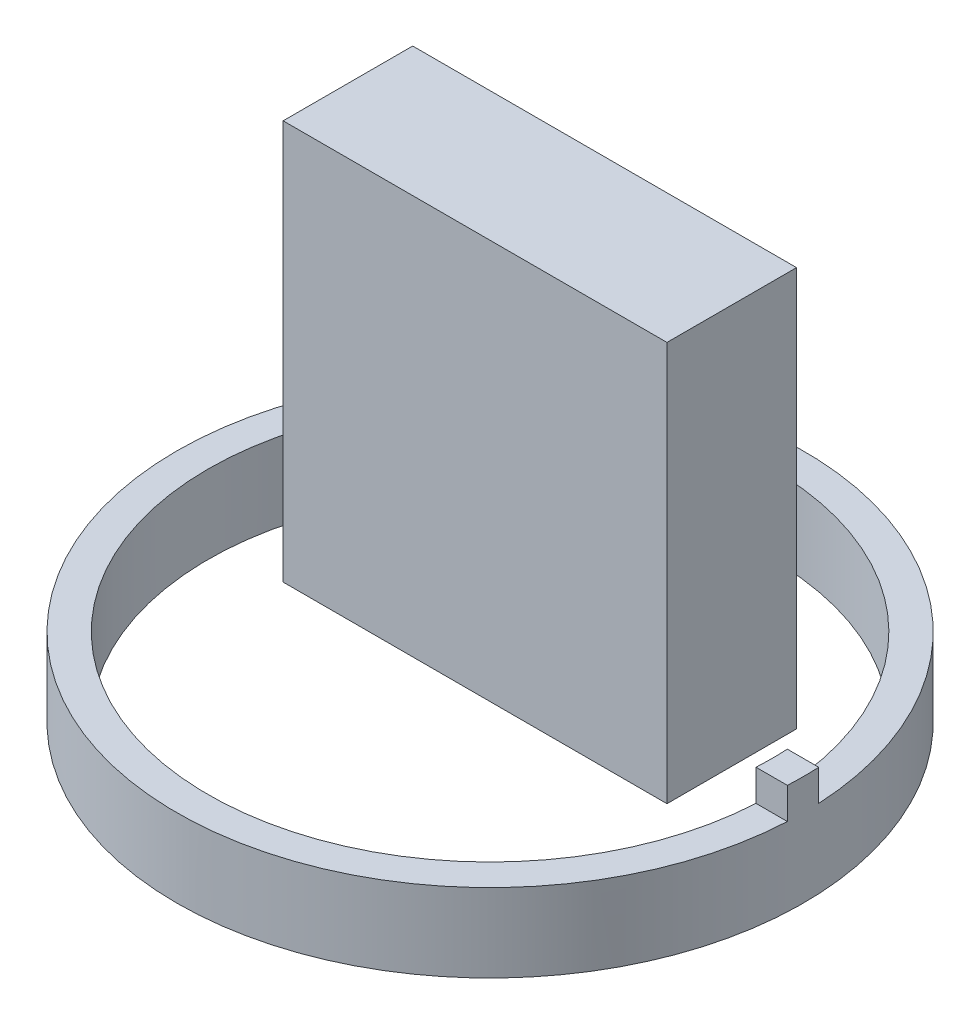
ISO-10303-21;
HEADER;
FILE_DESCRIPTION(('STEP AP214'),'2;1');
FILE_NAME('part.step','',(''),(''),'','','');
FILE_SCHEMA(('AUTOMOTIVE_DESIGN { 1 0 10303 214 1 1 1 1 }'));
ENDSEC;
DATA;
#1=APPLICATION_CONTEXT('core data for automotive mechanical design processes');
#2=APPLICATION_PROTOCOL_DEFINITION('international standard','automotive_design',2000,#1);
#3=PRODUCT_CONTEXT('',#1,'mechanical');
#4=PRODUCT('Part','Part','',(#3));
#5=PRODUCT_RELATED_PRODUCT_CATEGORY('part','',(#4));
#6=PRODUCT_DEFINITION_FORMATION('','',#4);
#7=PRODUCT_DEFINITION_CONTEXT('part definition',#1,'design');
#8=PRODUCT_DEFINITION('design','',#6,#7);
#9=PRODUCT_DEFINITION_SHAPE('','',#8);
#10=(LENGTH_UNIT() NAMED_UNIT(*) SI_UNIT(.MILLI.,.METRE.));
#11=(NAMED_UNIT(*) PLANE_ANGLE_UNIT() SI_UNIT($,.RADIAN.));
#12=(NAMED_UNIT(*) SI_UNIT($,.STERADIAN.) SOLID_ANGLE_UNIT());
#13=UNCERTAINTY_MEASURE_WITH_UNIT(LENGTH_MEASURE(1.E-05),#10,'distance_accuracy_value','');
#14=(GEOMETRIC_REPRESENTATION_CONTEXT(3) GLOBAL_UNCERTAINTY_ASSIGNED_CONTEXT((#13)) GLOBAL_UNIT_ASSIGNED_CONTEXT((#10,
#11,#12)) REPRESENTATION_CONTEXT('',''));
#15=CARTESIAN_POINT('',(0.,0.,0.));
#16=DIRECTION('',(0.,0.,1.));
#17=DIRECTION('',(1.,0.,0.));
#18=AXIS2_PLACEMENT_3D('',#15,#16,#17);
#19=CARTESIAN_POINT('',(0.,6.35,0.));
#20=DIRECTION('',(0.,1.,0.));
#21=DIRECTION('',(0.,0.,1.));
#22=AXIS2_PLACEMENT_3D('',#19,#20,#21);
#23=PLANE('',#22);
#24=CARTESIAN_POINT('',(0.,6.35,0.));
#25=DIRECTION('',(0.,1.,0.));
#26=DIRECTION('',(0.,0.,1.));
#27=AXIS2_PLACEMENT_3D('',#24,#25,#26);
#28=CIRCLE('',#27,25.4);
#29=CARTESIAN_POINT('',(25.3682301314065,6.35,-1.27));
#30=VERTEX_POINT('',#29);
#31=CARTESIAN_POINT('',(25.3682301314065,6.35,1.27));
#32=VERTEX_POINT('',#31);
#33=EDGE_CURVE('E13',#30,#32,#28,.T.);
#34=ORIENTED_EDGE('',*,*,#33,.T.);
#35=DIRECTION('',(-1.,0.,0.));
#36=VECTOR('',#35,1.);
#37=CARTESIAN_POINT('',(0.,6.35,1.27));
#38=LINE('',#37,#36);
#39=CARTESIAN_POINT('',(22.8246949596265,6.35,1.27));
#40=VERTEX_POINT('',#39);
#41=EDGE_CURVE('E75',#32,#40,#38,.T.);
#42=ORIENTED_EDGE('',*,*,#41,.T.);
#43=CARTESIAN_POINT('',(0.,6.35,0.));
#44=DIRECTION('',(0.,1.,0.));
#45=DIRECTION('',(0.,0.,1.));
#46=AXIS2_PLACEMENT_3D('',#43,#44,#45);
#47=CIRCLE('',#46,22.86);
#48=CARTESIAN_POINT('',(22.8246949596265,6.35,-1.27));
#49=VERTEX_POINT('',#48);
#50=EDGE_CURVE('E125',#49,#40,#47,.T.);
#51=ORIENTED_EDGE('',*,*,#50,.F.);
#52=DIRECTION('',(-1.,0.,0.));
#53=VECTOR('',#52,1.);
#54=CARTESIAN_POINT('',(0.,6.35,-1.27));
#55=LINE('',#54,#53);
#56=EDGE_CURVE('E80',#30,#49,#55,.T.);
#57=ORIENTED_EDGE('',*,*,#56,.F.);
#58=EDGE_LOOP('',(#34,#42,#51,#57));
#59=FACE_BOUND('',#58,.T.);
#60=ADVANCED_FACE('F61',(#59),#23,.T.);
#61=CARTESIAN_POINT('',(0.,0.,0.));
#62=DIRECTION('',(0.,1.,0.));
#63=DIRECTION('',(0.,0.,1.));
#64=AXIS2_PLACEMENT_3D('',#61,#62,#63);
#65=PLANE('',#64);
#66=CARTESIAN_POINT('',(0.,0.,0.));
#67=DIRECTION('',(0.,1.,0.));
#68=DIRECTION('',(0.,0.,1.));
#69=AXIS2_PLACEMENT_3D('',#66,#67,#68);
#70=CIRCLE('',#69,25.4);
#71=CARTESIAN_POINT('',(0.,0.,25.4));
#72=VERTEX_POINT('',#71);
#73=EDGE_CURVE('E65',#72,#72,#70,.T.);
#74=ORIENTED_EDGE('',*,*,#73,.F.);
#75=EDGE_LOOP('',(#74));
#76=FACE_BOUND('',#75,.T.);
#77=CARTESIAN_POINT('',(0.,0.,0.));
#78=DIRECTION('',(0.,1.,0.));
#79=DIRECTION('',(0.,0.,1.));
#80=AXIS2_PLACEMENT_3D('',#77,#78,#79);
#81=CIRCLE('',#80,22.86);
#82=CARTESIAN_POINT('',(0.,0.,22.86));
#83=VERTEX_POINT('',#82);
#84=EDGE_CURVE('E122',#83,#83,#81,.T.);
#85=ORIENTED_EDGE('',*,*,#84,.T.);
#86=EDGE_LOOP('',(#85));
#87=FACE_BOUND('',#86,.T.);
#88=ADVANCED_FACE('F136',(#76,#87),#65,.F.);
#89=CARTESIAN_POINT('',(0.,6.35,0.));
#90=DIRECTION('',(0.,-1.,0.));
#91=DIRECTION('',(0.,0.,-1.));
#92=AXIS2_PLACEMENT_3D('',#89,#90,#91);
#93=CYLINDRICAL_SURFACE('',#92,25.4);
#94=ORIENTED_EDGE('',*,*,#33,.F.);
#95=DIRECTION('',(0.,-1.,0.));
#96=VECTOR('',#95,1.);
#97=CARTESIAN_POINT('',(25.3682301314065,8.89,-1.27));
#98=LINE('',#97,#96);
#99=CARTESIAN_POINT('',(25.3682301314065,8.89,-1.27));
#100=VERTEX_POINT('',#99);
#101=EDGE_CURVE('E104',#100,#30,#98,.T.);
#102=ORIENTED_EDGE('',*,*,#101,.F.);
#103=CARTESIAN_POINT('',(0.,8.89,0.));
#104=DIRECTION('',(0.,1.,0.));
#105=DIRECTION('',(0.,0.,1.));
#106=AXIS2_PLACEMENT_3D('',#103,#104,#105);
#107=CIRCLE('',#106,25.4);
#108=CARTESIAN_POINT('',(25.3682301314065,8.89,1.27));
#109=VERTEX_POINT('',#108);
#110=EDGE_CURVE('E111',#109,#100,#107,.T.);
#111=ORIENTED_EDGE('',*,*,#110,.F.);
#112=DIRECTION('',(0.,-1.,0.));
#113=VECTOR('',#112,1.);
#114=CARTESIAN_POINT('',(25.3682301314065,8.89,1.27));
#115=LINE('',#114,#113);
#116=EDGE_CURVE('E154',#109,#32,#115,.T.);
#117=ORIENTED_EDGE('',*,*,#116,.T.);
#118=EDGE_LOOP('',(#94,#102,#111,#117));
#119=FACE_BOUND('',#118,.T.);
#120=ORIENTED_EDGE('',*,*,#73,.T.);
#121=EDGE_LOOP('',(#120));
#122=FACE_BOUND('',#121,.T.);
#123=ADVANCED_FACE('F63',(#119,#122),#93,.T.);
#124=CARTESIAN_POINT('',(0.,6.35,0.));
#125=DIRECTION('',(0.,-1.,0.));
#126=DIRECTION('',(0.,0.,-1.));
#127=AXIS2_PLACEMENT_3D('',#124,#125,#126);
#128=CYLINDRICAL_SURFACE('',#127,22.86);
#129=ORIENTED_EDGE('',*,*,#50,.T.);
#130=DIRECTION('',(0.,-1.,0.));
#131=VECTOR('',#130,1.);
#132=CARTESIAN_POINT('',(22.8246949596265,8.89,1.27));
#133=LINE('',#132,#131);
#134=CARTESIAN_POINT('',(22.8246949596265,8.89,1.27));
#135=VERTEX_POINT('',#134);
#136=EDGE_CURVE('E127',#135,#40,#133,.T.);
#137=ORIENTED_EDGE('',*,*,#136,.F.);
#138=CARTESIAN_POINT('',(0.,8.89,0.));
#139=DIRECTION('',(0.,1.,0.));
#140=DIRECTION('',(0.,0.,1.));
#141=AXIS2_PLACEMENT_3D('',#138,#139,#140);
#142=CIRCLE('',#141,22.86);
#143=CARTESIAN_POINT('',(22.8246949596265,8.89,-1.27));
#144=VERTEX_POINT('',#143);
#145=EDGE_CURVE('E110',#135,#144,#142,.T.);
#146=ORIENTED_EDGE('',*,*,#145,.T.);
#147=DIRECTION('',(0.,-1.,0.));
#148=VECTOR('',#147,1.);
#149=CARTESIAN_POINT('',(22.8246949596265,8.89,-1.27));
#150=LINE('',#149,#148);
#151=EDGE_CURVE('E106',#144,#49,#150,.T.);
#152=ORIENTED_EDGE('',*,*,#151,.T.);
#153=EDGE_LOOP('',(#129,#137,#146,#152));
#154=FACE_BOUND('',#153,.T.);
#155=ORIENTED_EDGE('',*,*,#84,.F.);
#156=EDGE_LOOP('',(#155));
#157=FACE_BOUND('',#156,.T.);
#158=ADVANCED_FACE('F141',(#154,#157),#128,.F.);
#159=CARTESIAN_POINT('',(0.,8.89,-1.27));
#160=DIRECTION('',(0.,0.,1.));
#161=DIRECTION('',(1.,0.,0.));
#162=AXIS2_PLACEMENT_3D('',#159,#160,#161);
#163=PLANE('',#162);
#164=ORIENTED_EDGE('',*,*,#56,.T.);
#165=ORIENTED_EDGE('',*,*,#151,.F.);
#166=DIRECTION('',(-1.,0.,0.));
#167=VECTOR('',#166,1.);
#168=CARTESIAN_POINT('',(0.,8.89,-1.27));
#169=LINE('',#168,#167);
#170=EDGE_CURVE('E100',#100,#144,#169,.T.);
#171=ORIENTED_EDGE('',*,*,#170,.F.);
#172=ORIENTED_EDGE('',*,*,#101,.T.);
#173=EDGE_LOOP('',(#164,#165,#171,#172));
#174=FACE_BOUND('',#173,.T.);
#175=ADVANCED_FACE('F102',(#174),#163,.F.);
#176=CARTESIAN_POINT('',(0.,8.89,1.27));
#177=DIRECTION('',(0.,0.,1.));
#178=DIRECTION('',(1.,0.,0.));
#179=AXIS2_PLACEMENT_3D('',#176,#177,#178);
#180=PLANE('',#179);
#181=ORIENTED_EDGE('',*,*,#41,.F.);
#182=ORIENTED_EDGE('',*,*,#116,.F.);
#183=DIRECTION('',(-1.,0.,0.));
#184=VECTOR('',#183,1.);
#185=CARTESIAN_POINT('',(0.,8.89,1.27));
#186=LINE('',#185,#184);
#187=EDGE_CURVE('E117',#109,#135,#186,.T.);
#188=ORIENTED_EDGE('',*,*,#187,.T.);
#189=ORIENTED_EDGE('',*,*,#136,.T.);
#190=EDGE_LOOP('',(#181,#182,#188,#189));
#191=FACE_BOUND('',#190,.T.);
#192=ADVANCED_FACE('F148',(#191),#180,.T.);
#193=CARTESIAN_POINT('',(0.,8.89,0.));
#194=DIRECTION('',(0.,1.,0.));
#195=DIRECTION('',(0.,0.,1.));
#196=AXIS2_PLACEMENT_3D('',#193,#194,#195);
#197=PLANE('',#196);
#198=ORIENTED_EDGE('',*,*,#110,.T.);
#199=ORIENTED_EDGE('',*,*,#170,.T.);
#200=ORIENTED_EDGE('',*,*,#145,.F.);
#201=ORIENTED_EDGE('',*,*,#187,.F.);
#202=EDGE_LOOP('',(#198,#199,#200,#201));
#203=FACE_BOUND('',#202,.T.);
#204=ADVANCED_FACE('F115',(#203),#197,.T.);
#205=CLOSED_SHELL('',(#60,#88,#123,#158,#175,#192,#204));
#206=MANIFOLD_SOLID_BREP('B2',#205);
#207=CARTESIAN_POINT('',(-18.2254134035002,32.385,-1.44966362960123));
#208=DIRECTION('',(0.,0.,-1.));
#209=DIRECTION('',(-1.,0.,0.));
#210=AXIS2_PLACEMENT_3D('',#207,#208,#209);
#211=PLANE('',#210);
#212=DIRECTION('',(1.,0.,0.));
#213=VECTOR('',#212,1.);
#214=CARTESIAN_POINT('',(-18.2254134035002,0.,-1.44966362960123));
#215=LINE('',#214,#213);
#216=CARTESIAN_POINT('',(-18.2254134035002,0.,-1.44966362960123));
#217=VERTEX_POINT('',#216);
#218=CARTESIAN_POINT('',(12.8895865964998,0.,-1.44966362960123));
#219=VERTEX_POINT('',#218);
#220=EDGE_CURVE('E279',#217,#219,#215,.T.);
#221=ORIENTED_EDGE('',*,*,#220,.T.);
#222=DIRECTION('',(0.,-1.,0.));
#223=VECTOR('',#222,1.);
#224=CARTESIAN_POINT('',(12.8895865964998,32.385,-1.44966362960123));
#225=LINE('',#224,#223);
#226=CARTESIAN_POINT('',(12.8895865964998,32.385,-1.44966362960123));
#227=VERTEX_POINT('',#226);
#228=EDGE_CURVE('E59',#227,#219,#225,.T.);
#229=ORIENTED_EDGE('',*,*,#228,.F.);
#230=DIRECTION('',(1.,0.,0.));
#231=VECTOR('',#230,1.);
#232=CARTESIAN_POINT('',(-18.2254134035002,32.385,-1.44966362960123));
#233=LINE('',#232,#231);
#234=CARTESIAN_POINT('',(-18.2254134035002,32.385,-1.44966362960123));
#235=VERTEX_POINT('',#234);
#236=EDGE_CURVE('E252',#235,#227,#233,.T.);
#237=ORIENTED_EDGE('',*,*,#236,.F.);
#238=DIRECTION('',(0.,-1.,0.));
#239=VECTOR('',#238,1.);
#240=CARTESIAN_POINT('',(-18.2254134035002,32.385,-1.44966362960123));
#241=LINE('',#240,#239);
#242=EDGE_CURVE('E275',#235,#217,#241,.T.);
#243=ORIENTED_EDGE('',*,*,#242,.T.);
#244=EDGE_LOOP('',(#221,#229,#237,#243));
#245=FACE_BOUND('',#244,.T.);
#246=ADVANCED_FACE('F212',(#245),#211,.F.);
#247=CARTESIAN_POINT('',(12.8895865964998,32.385,-11.9525636296012));
#248=DIRECTION('',(1.,0.,0.));
#249=DIRECTION('',(0.,0.,-1.));
#250=AXIS2_PLACEMENT_3D('',#247,#248,#249);
#251=PLANE('',#250);
#252=DIRECTION('',(0.,0.,1.));
#253=VECTOR('',#252,1.);
#254=CARTESIAN_POINT('',(12.8895865964998,0.,-11.9525636296012));
#255=LINE('',#254,#253);
#256=CARTESIAN_POINT('',(12.8895865964998,0.,-11.9525636296012));
#257=VERTEX_POINT('',#256);
#258=EDGE_CURVE('E261',#257,#219,#255,.T.);
#259=ORIENTED_EDGE('',*,*,#258,.F.);
#260=DIRECTION('',(0.,-1.,0.));
#261=VECTOR('',#260,1.);
#262=CARTESIAN_POINT('',(12.8895865964998,32.385,-11.9525636296012));
#263=LINE('',#262,#261);
#264=CARTESIAN_POINT('',(12.8895865964998,32.385,-11.9525636296012));
#265=VERTEX_POINT('',#264);
#266=EDGE_CURVE('E221',#265,#257,#263,.T.);
#267=ORIENTED_EDGE('',*,*,#266,.F.);
#268=DIRECTION('',(0.,0.,1.));
#269=VECTOR('',#268,1.);
#270=CARTESIAN_POINT('',(12.8895865964998,32.385,-11.9525636296012));
#271=LINE('',#270,#269);
#272=EDGE_CURVE('E259',#265,#227,#271,.T.);
#273=ORIENTED_EDGE('',*,*,#272,.T.);
#274=ORIENTED_EDGE('',*,*,#228,.T.);
#275=EDGE_LOOP('',(#259,#267,#273,#274));
#276=FACE_BOUND('',#275,.T.);
#277=ADVANCED_FACE('F258',(#276),#251,.T.);
#278=CARTESIAN_POINT('',(-18.2254134035002,32.385,-11.9525636296012));
#279=DIRECTION('',(0.,0.,-1.));
#280=DIRECTION('',(-1.,0.,0.));
#281=AXIS2_PLACEMENT_3D('',#278,#279,#280);
#282=PLANE('',#281);
#283=DIRECTION('',(1.,0.,0.));
#284=VECTOR('',#283,1.);
#285=CARTESIAN_POINT('',(-18.2254134035002,0.,-11.9525636296012));
#286=LINE('',#285,#284);
#287=CARTESIAN_POINT('',(-18.2254134035002,0.,-11.9525636296012));
#288=VERTEX_POINT('',#287);
#289=EDGE_CURVE('E285',#288,#257,#286,.T.);
#290=ORIENTED_EDGE('',*,*,#289,.F.);
#291=DIRECTION('',(0.,-1.,0.));
#292=VECTOR('',#291,1.);
#293=CARTESIAN_POINT('',(-18.2254134035002,32.385,-11.9525636296012));
#294=LINE('',#293,#292);
#295=CARTESIAN_POINT('',(-18.2254134035002,32.385,-11.9525636296012));
#296=VERTEX_POINT('',#295);
#297=EDGE_CURVE('E244',#296,#288,#294,.T.);
#298=ORIENTED_EDGE('',*,*,#297,.F.);
#299=DIRECTION('',(1.,0.,0.));
#300=VECTOR('',#299,1.);
#301=CARTESIAN_POINT('',(-18.2254134035002,32.385,-11.9525636296012));
#302=LINE('',#301,#300);
#303=EDGE_CURVE('E268',#296,#265,#302,.T.);
#304=ORIENTED_EDGE('',*,*,#303,.T.);
#305=ORIENTED_EDGE('',*,*,#266,.T.);
#306=EDGE_LOOP('',(#290,#298,#304,#305));
#307=FACE_BOUND('',#306,.T.);
#308=ADVANCED_FACE('F271',(#307),#282,.T.);
#309=CARTESIAN_POINT('',(-18.2254134035002,32.385,-11.9525636296012));
#310=DIRECTION('',(1.,0.,0.));
#311=DIRECTION('',(0.,0.,-1.));
#312=AXIS2_PLACEMENT_3D('',#309,#310,#311);
#313=PLANE('',#312);
#314=DIRECTION('',(0.,0.,1.));
#315=VECTOR('',#314,1.);
#316=CARTESIAN_POINT('',(-18.2254134035002,0.,-11.9525636296012));
#317=LINE('',#316,#315);
#318=EDGE_CURVE('E247',#288,#217,#317,.T.);
#319=ORIENTED_EDGE('',*,*,#318,.T.);
#320=ORIENTED_EDGE('',*,*,#242,.F.);
#321=DIRECTION('',(0.,0.,1.));
#322=VECTOR('',#321,1.);
#323=CARTESIAN_POINT('',(-18.2254134035002,32.385,-11.9525636296012));
#324=LINE('',#323,#322);
#325=EDGE_CURVE('E229',#296,#235,#324,.T.);
#326=ORIENTED_EDGE('',*,*,#325,.F.);
#327=ORIENTED_EDGE('',*,*,#297,.T.);
#328=EDGE_LOOP('',(#319,#320,#326,#327));
#329=FACE_BOUND('',#328,.T.);
#330=ADVANCED_FACE('F302',(#329),#313,.F.);
#331=CARTESIAN_POINT('',(0.,32.385,0.));
#332=DIRECTION('',(0.,-1.,0.));
#333=DIRECTION('',(0.,0.,-1.));
#334=AXIS2_PLACEMENT_3D('',#331,#332,#333);
#335=PLANE('',#334);
#336=ORIENTED_EDGE('',*,*,#236,.T.);
#337=ORIENTED_EDGE('',*,*,#272,.F.);
#338=ORIENTED_EDGE('',*,*,#303,.F.);
#339=ORIENTED_EDGE('',*,*,#325,.T.);
#340=EDGE_LOOP('',(#336,#337,#338,#339));
#341=FACE_BOUND('',#340,.T.);
#342=ADVANCED_FACE('F267',(#341),#335,.F.);
#343=CARTESIAN_POINT('',(0.,0.,0.));
#344=DIRECTION('',(0.,-1.,0.));
#345=DIRECTION('',(0.,0.,-1.));
#346=AXIS2_PLACEMENT_3D('',#343,#344,#345);
#347=PLANE('',#346);
#348=ORIENTED_EDGE('',*,*,#220,.F.);
#349=ORIENTED_EDGE('',*,*,#318,.F.);
#350=ORIENTED_EDGE('',*,*,#289,.T.);
#351=ORIENTED_EDGE('',*,*,#258,.T.);
#352=EDGE_LOOP('',(#348,#349,#350,#351));
#353=FACE_BOUND('',#352,.T.);
#354=ADVANCED_FACE('F296',(#353),#347,.T.);
#355=CLOSED_SHELL('',(#246,#277,#308,#330,#342,#354));
#356=MANIFOLD_SOLID_BREP('B7',#355);
#357=ADVANCED_BREP_SHAPE_REPRESENTATION('',(#18,#206,#356),#14);
#358=SHAPE_DEFINITION_REPRESENTATION(#9,#357);
ENDSEC;
END-ISO-10303-21;
